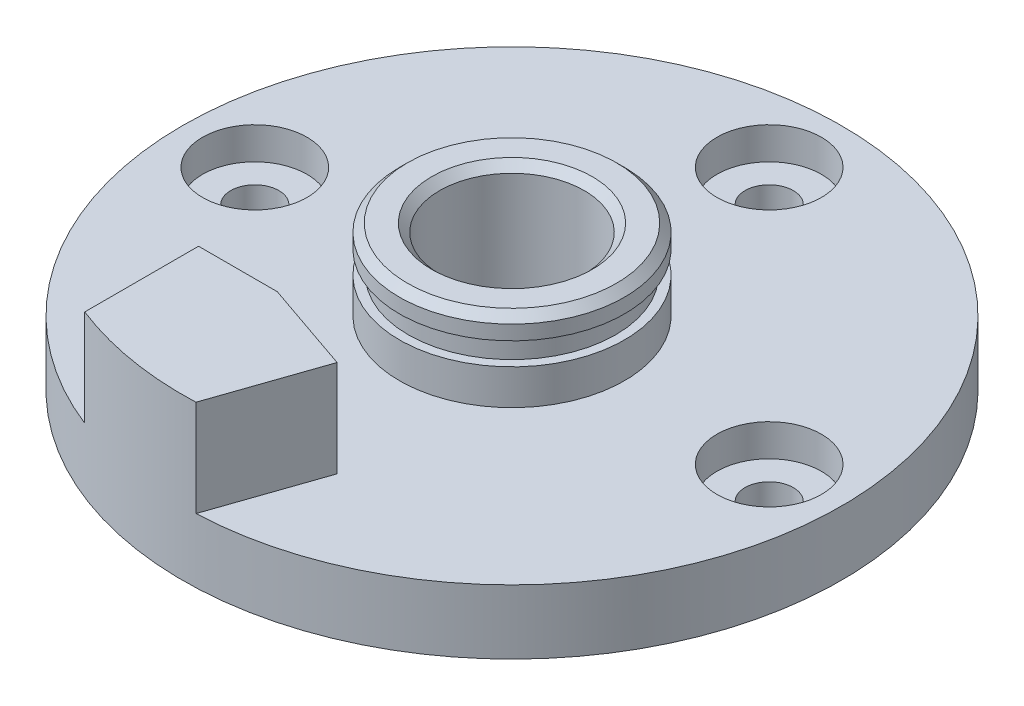
ISO-10303-21;
HEADER;
FILE_DESCRIPTION(('STEP AP214'),'2;1');
FILE_NAME('part.step','',(''),(''),'','','');
FILE_SCHEMA(('AUTOMOTIVE_DESIGN { 1 0 10303 214 1 1 1 1 }'));
ENDSEC;
DATA;
#1=APPLICATION_CONTEXT('core data for automotive mechanical design processes');
#2=APPLICATION_PROTOCOL_DEFINITION('international standard','automotive_design',2000,#1);
#3=PRODUCT_CONTEXT('',#1,'mechanical');
#4=PRODUCT('Part','Part','',(#3));
#5=PRODUCT_RELATED_PRODUCT_CATEGORY('part','',(#4));
#6=PRODUCT_DEFINITION_FORMATION('','',#4);
#7=PRODUCT_DEFINITION_CONTEXT('part definition',#1,'design');
#8=PRODUCT_DEFINITION('design','',#6,#7);
#9=PRODUCT_DEFINITION_SHAPE('','',#8);
#10=(LENGTH_UNIT() NAMED_UNIT(*) SI_UNIT(.MILLI.,.METRE.));
#11=(NAMED_UNIT(*) PLANE_ANGLE_UNIT() SI_UNIT($,.RADIAN.));
#12=(NAMED_UNIT(*) SI_UNIT($,.STERADIAN.) SOLID_ANGLE_UNIT());
#13=UNCERTAINTY_MEASURE_WITH_UNIT(LENGTH_MEASURE(1.E-05),#10,'distance_accuracy_value','');
#14=(GEOMETRIC_REPRESENTATION_CONTEXT(3) GLOBAL_UNCERTAINTY_ASSIGNED_CONTEXT((#13)) GLOBAL_UNIT_ASSIGNED_CONTEXT((#10,
#11,#12)) REPRESENTATION_CONTEXT('',''));
#15=CARTESIAN_POINT('',(0.,0.,0.));
#16=DIRECTION('',(0.,0.,1.));
#17=DIRECTION('',(1.,0.,0.));
#18=AXIS2_PLACEMENT_3D('',#15,#16,#17);
#19=CARTESIAN_POINT('',(-20.5,4.,0.));
#20=DIRECTION('',(0.,1.,0.));
#21=DIRECTION('',(-1.,0.,0.));
#22=AXIS2_PLACEMENT_3D('',#19,#20,#21);
#23=PLANE('',#22);
#24=CARTESIAN_POINT('',(-16.,4.,0.));
#25=DIRECTION('',(0.,1.,0.));
#26=DIRECTION('',(-1.,0.,0.));
#27=AXIS2_PLACEMENT_3D('',#24,#25,#26);
#28=CIRCLE('',#27,3.25);
#29=CARTESIAN_POINT('',(-19.25,4.,0.));
#30=VERTEX_POINT('',#29);
#31=EDGE_CURVE('E135',#30,#30,#28,.T.);
#32=ORIENTED_EDGE('',*,*,#31,.F.);
#33=EDGE_LOOP('',(#32));
#34=FACE_BOUND('',#33,.T.);
#35=CARTESIAN_POINT('',(0.,4.,-16.));
#36=DIRECTION('',(0.,1.,0.));
#37=DIRECTION('',(-1.,0.,0.));
#38=AXIS2_PLACEMENT_3D('',#35,#36,#37);
#39=CIRCLE('',#38,3.25);
#40=CARTESIAN_POINT('',(-3.25,4.,-16.));
#41=VERTEX_POINT('',#40);
#42=EDGE_CURVE('E141',#41,#41,#39,.T.);
#43=ORIENTED_EDGE('',*,*,#42,.F.);
#44=EDGE_LOOP('',(#43));
#45=FACE_BOUND('',#44,.T.);
#46=CARTESIAN_POINT('',(16.,3.99999999999999,0.));
#47=DIRECTION('',(0.,1.,0.));
#48=DIRECTION('',(-1.,0.,0.));
#49=AXIS2_PLACEMENT_3D('',#46,#47,#48);
#50=CIRCLE('',#49,3.25);
#51=CARTESIAN_POINT('',(12.75,3.99999999999999,0.));
#52=VERTEX_POINT('',#51);
#53=EDGE_CURVE('E130',#52,#52,#50,.T.);
#54=ORIENTED_EDGE('',*,*,#53,.F.);
#55=EDGE_LOOP('',(#54));
#56=FACE_BOUND('',#55,.T.);
#57=CARTESIAN_POINT('',(0.,4.,0.));
#58=DIRECTION('',(0.,1.,0.));
#59=DIRECTION('',(-1.,0.,0.));
#60=AXIS2_PLACEMENT_3D('',#57,#58,#59);
#61=CIRCLE('',#60,7.);
#62=CARTESIAN_POINT('',(-7.,4.,0.));
#63=VERTEX_POINT('',#62);
#64=EDGE_CURVE('E171',#63,#63,#61,.T.);
#65=ORIENTED_EDGE('',*,*,#64,.F.);
#66=EDGE_LOOP('',(#65));
#67=FACE_BOUND('',#66,.T.);
#68=DIRECTION('',(-0.94551857559932,0.,-0.325568154457147));
#69=VECTOR('',#68,1.);
#70=CARTESIAN_POINT('',(-2.6,4.,12.));
#71=LINE('',#70,#69);
#72=CARTESIAN_POINT('',(3.07311145359592,4.,13.9534089267429));
#73=VERTEX_POINT('',#72);
#74=CARTESIAN_POINT('',(-2.6,4.,12.));
#75=VERTEX_POINT('',#74);
#76=EDGE_CURVE('E47',#73,#75,#71,.T.);
#77=ORIENTED_EDGE('',*,*,#76,.F.);
#78=DIRECTION('',(0.325568154457147,0.,-0.94551857559932));
#79=VECTOR('',#78,1.);
#80=CARTESIAN_POINT('',(3.07311145359592,4.,13.9534089267429));
#81=LINE('',#80,#79);
#82=CARTESIAN_POINT('',(0.824652926444339,4.,20.4834066392997));
#83=VERTEX_POINT('',#82);
#84=EDGE_CURVE('E51',#83,#73,#81,.T.);
#85=ORIENTED_EDGE('',*,*,#84,.F.);
#86=CARTESIAN_POINT('',(0.,4.,0.));
#87=DIRECTION('',(0.,1.,0.));
#88=DIRECTION('',(-1.,0.,0.));
#89=AXIS2_PLACEMENT_3D('',#86,#87,#88);
#90=CIRCLE('',#89,20.5);
#91=CARTESIAN_POINT('',(-7.5,4.,19.0787840283389));
#92=VERTEX_POINT('',#91);
#93=EDGE_CURVE('E95',#83,#92,#90,.T.);
#94=ORIENTED_EDGE('',*,*,#93,.T.);
#95=DIRECTION('',(0.,0.,1.));
#96=VECTOR('',#95,1.);
#97=CARTESIAN_POINT('',(-7.5,4.,12.));
#98=LINE('',#97,#96);
#99=CARTESIAN_POINT('',(-7.5,4.,12.));
#100=VERTEX_POINT('',#99);
#101=EDGE_CURVE('E121',#100,#92,#98,.T.);
#102=ORIENTED_EDGE('',*,*,#101,.F.);
#103=DIRECTION('',(-1.,0.,0.));
#104=VECTOR('',#103,1.);
#105=CARTESIAN_POINT('',(7.5,4.,12.));
#106=LINE('',#105,#104);
#107=EDGE_CURVE('E116',#75,#100,#106,.T.);
#108=ORIENTED_EDGE('',*,*,#107,.F.);
#109=EDGE_LOOP('',(#77,#85,#94,#102,#108));
#110=FACE_BOUND('',#109,.T.);
#111=ADVANCED_FACE('F32',(#34,#45,#56,#67,#110),#23,.T.);
#112=CARTESIAN_POINT('',(0.,7.,0.));
#113=DIRECTION('',(0.,1.,0.));
#114=DIRECTION('',(-1.,0.,0.));
#115=AXIS2_PLACEMENT_3D('',#112,#113,#114);
#116=CYLINDRICAL_SURFACE('',#115,4.5);
#117=CARTESIAN_POINT('',(0.,8.49999999999999,0.));
#118=DIRECTION('',(0.,1.,0.));
#119=DIRECTION('',(-1.,0.,0.));
#120=AXIS2_PLACEMENT_3D('',#117,#118,#119);
#121=CIRCLE('',#120,4.5);
#122=CARTESIAN_POINT('',(-4.5,8.49999999999999,0.));
#123=VERTEX_POINT('',#122);
#124=EDGE_CURVE('E188',#123,#123,#121,.T.);
#125=ORIENTED_EDGE('',*,*,#124,.T.);
#126=EDGE_LOOP('',(#125));
#127=FACE_BOUND('',#126,.T.);
#128=CARTESIAN_POINT('',(0.,1.50000000000001,0.));
#129=DIRECTION('',(0.,-1.,0.));
#130=DIRECTION('',(1.,0.,0.));
#131=AXIS2_PLACEMENT_3D('',#128,#129,#130);
#132=CIRCLE('',#131,4.5);
#133=CARTESIAN_POINT('',(4.5,1.50000000000001,0.));
#134=VERTEX_POINT('',#133);
#135=EDGE_CURVE('E178',#134,#134,#132,.T.);
#136=ORIENTED_EDGE('',*,*,#135,.T.);
#137=EDGE_LOOP('',(#136));
#138=FACE_BOUND('',#137,.T.);
#139=ADVANCED_FACE('F215',(#127,#138),#116,.F.);
#140=CARTESIAN_POINT('',(16.,9.,0.));
#141=DIRECTION('',(0.,-1.,0.));
#142=DIRECTION('',(0.,0.,-1.));
#143=AXIS2_PLACEMENT_3D('',#140,#141,#142);
#144=CYLINDRICAL_SURFACE('',#143,1.5);
#145=CARTESIAN_POINT('',(16.,0.,0.));
#146=DIRECTION('',(0.,1.,0.));
#147=DIRECTION('',(0.,0.,1.));
#148=AXIS2_PLACEMENT_3D('',#145,#146,#147);
#149=CIRCLE('',#148,1.5);
#150=CARTESIAN_POINT('',(16.,0.,1.5));
#151=VERTEX_POINT('',#150);
#152=EDGE_CURVE('E156',#151,#151,#149,.T.);
#153=ORIENTED_EDGE('',*,*,#152,.F.);
#154=EDGE_LOOP('',(#153));
#155=FACE_BOUND('',#154,.T.);
#156=CARTESIAN_POINT('',(16.,1.99999999999999,0.));
#157=DIRECTION('',(0.,1.,0.));
#158=DIRECTION('',(-1.,0.,0.));
#159=AXIS2_PLACEMENT_3D('',#156,#157,#158);
#160=CIRCLE('',#159,1.5);
#161=CARTESIAN_POINT('',(14.5,1.99999999999999,0.));
#162=VERTEX_POINT('',#161);
#163=EDGE_CURVE('E159',#162,#162,#160,.T.);
#164=ORIENTED_EDGE('',*,*,#163,.T.);
#165=EDGE_LOOP('',(#164));
#166=FACE_BOUND('',#165,.T.);
#167=ADVANCED_FACE('F221',(#155,#166),#144,.F.);
#168=CARTESIAN_POINT('',(0.,9.,-16.));
#169=DIRECTION('',(0.,-1.,0.));
#170=DIRECTION('',(0.,0.,-1.));
#171=AXIS2_PLACEMENT_3D('',#168,#169,#170);
#172=CYLINDRICAL_SURFACE('',#171,1.5);
#173=CARTESIAN_POINT('',(0.,0.,-16.));
#174=DIRECTION('',(0.,1.,0.));
#175=DIRECTION('',(0.,0.,1.));
#176=AXIS2_PLACEMENT_3D('',#173,#174,#175);
#177=CIRCLE('',#176,1.5);
#178=CARTESIAN_POINT('',(0.,0.,-14.5));
#179=VERTEX_POINT('',#178);
#180=EDGE_CURVE('E153',#179,#179,#177,.T.);
#181=ORIENTED_EDGE('',*,*,#180,.F.);
#182=EDGE_LOOP('',(#181));
#183=FACE_BOUND('',#182,.T.);
#184=CARTESIAN_POINT('',(0.,2.,-16.));
#185=DIRECTION('',(0.,1.,0.));
#186=DIRECTION('',(-1.,0.,0.));
#187=AXIS2_PLACEMENT_3D('',#184,#185,#186);
#188=CIRCLE('',#187,1.5);
#189=CARTESIAN_POINT('',(-1.5,2.,-16.));
#190=VERTEX_POINT('',#189);
#191=EDGE_CURVE('E181',#190,#190,#188,.T.);
#192=ORIENTED_EDGE('',*,*,#191,.T.);
#193=EDGE_LOOP('',(#192));
#194=FACE_BOUND('',#193,.T.);
#195=ADVANCED_FACE('F312',(#183,#194),#172,.F.);
#196=CARTESIAN_POINT('',(-16.,9.,0.));
#197=DIRECTION('',(0.,-1.,0.));
#198=DIRECTION('',(0.,0.,-1.));
#199=AXIS2_PLACEMENT_3D('',#196,#197,#198);
#200=CYLINDRICAL_SURFACE('',#199,1.5);
#201=CARTESIAN_POINT('',(-16.,0.,0.));
#202=DIRECTION('',(0.,1.,0.));
#203=DIRECTION('',(0.,0.,1.));
#204=AXIS2_PLACEMENT_3D('',#201,#202,#203);
#205=CIRCLE('',#204,1.5);
#206=CARTESIAN_POINT('',(-16.,0.,1.5));
#207=VERTEX_POINT('',#206);
#208=EDGE_CURVE('E149',#207,#207,#205,.T.);
#209=ORIENTED_EDGE('',*,*,#208,.F.);
#210=EDGE_LOOP('',(#209));
#211=FACE_BOUND('',#210,.T.);
#212=CARTESIAN_POINT('',(-16.,2.,0.));
#213=DIRECTION('',(0.,1.,0.));
#214=DIRECTION('',(-1.,0.,0.));
#215=AXIS2_PLACEMENT_3D('',#212,#213,#214);
#216=CIRCLE('',#215,1.5);
#217=CARTESIAN_POINT('',(-17.5,2.,0.));
#218=VERTEX_POINT('',#217);
#219=EDGE_CURVE('E134',#218,#218,#216,.T.);
#220=ORIENTED_EDGE('',*,*,#219,.T.);
#221=EDGE_LOOP('',(#220));
#222=FACE_BOUND('',#221,.T.);
#223=ADVANCED_FACE('F234',(#211,#222),#200,.F.);
#224=CARTESIAN_POINT('',(-4.5,0.,0.));
#225=DIRECTION('',(0.,-1.,0.));
#226=DIRECTION('',(1.,0.,0.));
#227=AXIS2_PLACEMENT_3D('',#224,#225,#226);
#228=PLANE('',#227);
#229=CARTESIAN_POINT('',(0.,0.,0.));
#230=DIRECTION('',(0.,-1.,0.));
#231=DIRECTION('',(1.,0.,0.));
#232=AXIS2_PLACEMENT_3D('',#229,#230,#231);
#233=CIRCLE('',#232,7.5);
#234=CARTESIAN_POINT('',(7.5,0.,0.));
#235=VERTEX_POINT('',#234);
#236=EDGE_CURVE('E112',#235,#235,#233,.T.);
#237=ORIENTED_EDGE('',*,*,#236,.F.);
#238=EDGE_LOOP('',(#237));
#239=FACE_BOUND('',#238,.T.);
#240=ORIENTED_EDGE('',*,*,#208,.T.);
#241=EDGE_LOOP('',(#240));
#242=FACE_BOUND('',#241,.T.);
#243=ORIENTED_EDGE('',*,*,#180,.T.);
#244=EDGE_LOOP('',(#243));
#245=FACE_BOUND('',#244,.T.);
#246=ORIENTED_EDGE('',*,*,#152,.T.);
#247=EDGE_LOOP('',(#246));
#248=FACE_BOUND('',#247,.T.);
#249=CARTESIAN_POINT('',(0.,0.,0.));
#250=DIRECTION('',(0.,1.,0.));
#251=DIRECTION('',(-1.,0.,0.));
#252=AXIS2_PLACEMENT_3D('',#249,#250,#251);
#253=CIRCLE('',#252,20.5);
#254=CARTESIAN_POINT('',(-20.5,0.,0.));
#255=VERTEX_POINT('',#254);
#256=EDGE_CURVE('E175',#255,#255,#253,.T.);
#257=ORIENTED_EDGE('',*,*,#256,.F.);
#258=EDGE_LOOP('',(#257));
#259=FACE_BOUND('',#258,.T.);
#260=ADVANCED_FACE('F232',(#239,#242,#245,#248,#259),#228,.T.);
#261=CARTESIAN_POINT('',(0.,7.,0.));
#262=DIRECTION('',(0.,1.,0.));
#263=DIRECTION('',(-1.,0.,0.));
#264=AXIS2_PLACEMENT_3D('',#261,#262,#263);
#265=CYLINDRICAL_SURFACE('',#264,20.5);
#266=ORIENTED_EDGE('',*,*,#93,.F.);
#267=DIRECTION('',(0.,-1.,0.));
#268=VECTOR('',#267,1.);
#269=CARTESIAN_POINT('',(0.824652926444336,10.,20.4834066392997));
#270=LINE('',#269,#268);
#271=CARTESIAN_POINT('',(0.824652926444336,10.,20.4834066392997));
#272=VERTEX_POINT('',#271);
#273=EDGE_CURVE('E92',#272,#83,#270,.T.);
#274=ORIENTED_EDGE('',*,*,#273,.F.);
#275=CARTESIAN_POINT('',(0.,10.,0.));
#276=DIRECTION('',(0.,1.,0.));
#277=DIRECTION('',(1.,0.,0.));
#278=AXIS2_PLACEMENT_3D('',#275,#276,#277);
#279=CIRCLE('',#278,20.5);
#280=CARTESIAN_POINT('',(-7.49999999999999,10.,19.0787840283389));
#281=VERTEX_POINT('',#280);
#282=EDGE_CURVE('E77',#281,#272,#279,.T.);
#283=ORIENTED_EDGE('',*,*,#282,.F.);
#284=DIRECTION('',(0.,-1.,0.));
#285=VECTOR('',#284,1.);
#286=CARTESIAN_POINT('',(-7.49999999999999,10.,19.0787840283389));
#287=LINE('',#286,#285);
#288=EDGE_CURVE('E89',#281,#92,#287,.T.);
#289=ORIENTED_EDGE('',*,*,#288,.T.);
#290=EDGE_LOOP('',(#266,#274,#283,#289));
#291=FACE_BOUND('',#290,.T.);
#292=ORIENTED_EDGE('',*,*,#256,.T.);
#293=EDGE_LOOP('',(#292));
#294=FACE_BOUND('',#293,.T.);
#295=ADVANCED_FACE('F93',(#291,#294),#265,.T.);
#296=CARTESIAN_POINT('',(0.,7.,0.));
#297=DIRECTION('',(0.,1.,0.));
#298=DIRECTION('',(-1.,0.,0.));
#299=AXIS2_PLACEMENT_3D('',#296,#297,#298);
#300=CYLINDRICAL_SURFACE('',#299,7.);
#301=ORIENTED_EDGE('',*,*,#64,.T.);
#302=EDGE_LOOP('',(#301));
#303=FACE_BOUND('',#302,.T.);
#304=CARTESIAN_POINT('',(0.,6.2,0.));
#305=DIRECTION('',(0.,1.,0.));
#306=DIRECTION('',(-1.,0.,0.));
#307=AXIS2_PLACEMENT_3D('',#304,#305,#306);
#308=CIRCLE('',#307,7.);
#309=CARTESIAN_POINT('',(-7.,6.2,0.));
#310=VERTEX_POINT('',#309);
#311=EDGE_CURVE('E168',#310,#310,#308,.T.);
#312=ORIENTED_EDGE('',*,*,#311,.F.);
#313=EDGE_LOOP('',(#312));
#314=FACE_BOUND('',#313,.T.);
#315=ADVANCED_FACE('F228',(#303,#314),#300,.T.);
#316=CARTESIAN_POINT('',(-7.,6.2,0.));
#317=DIRECTION('',(0.,1.,0.));
#318=DIRECTION('',(-1.,0.,0.));
#319=AXIS2_PLACEMENT_3D('',#316,#317,#318);
#320=PLANE('',#319);
#321=ORIENTED_EDGE('',*,*,#311,.T.);
#322=EDGE_LOOP('',(#321));
#323=FACE_BOUND('',#322,.T.);
#324=CARTESIAN_POINT('',(0.,6.2,0.));
#325=DIRECTION('',(0.,1.,0.));
#326=DIRECTION('',(-1.,0.,0.));
#327=AXIS2_PLACEMENT_3D('',#324,#325,#326);
#328=CIRCLE('',#327,6.45);
#329=CARTESIAN_POINT('',(-6.45,6.2,0.));
#330=VERTEX_POINT('',#329);
#331=EDGE_CURVE('E165',#330,#330,#328,.T.);
#332=ORIENTED_EDGE('',*,*,#331,.F.);
#333=EDGE_LOOP('',(#332));
#334=FACE_BOUND('',#333,.T.);
#335=ADVANCED_FACE('F274',(#323,#334),#320,.T.);
#336=CARTESIAN_POINT('',(0.,7.,0.));
#337=DIRECTION('',(0.,1.,0.));
#338=DIRECTION('',(-1.,0.,0.));
#339=AXIS2_PLACEMENT_3D('',#336,#337,#338);
#340=CYLINDRICAL_SURFACE('',#339,6.45);
#341=ORIENTED_EDGE('',*,*,#331,.T.);
#342=EDGE_LOOP('',(#341));
#343=FACE_BOUND('',#342,.T.);
#344=CARTESIAN_POINT('',(0.,7.6,0.));
#345=DIRECTION('',(0.,1.,0.));
#346=DIRECTION('',(-1.,0.,0.));
#347=AXIS2_PLACEMENT_3D('',#344,#345,#346);
#348=CIRCLE('',#347,6.45);
#349=CARTESIAN_POINT('',(-6.45,7.6,0.));
#350=VERTEX_POINT('',#349);
#351=EDGE_CURVE('E162',#350,#350,#348,.T.);
#352=ORIENTED_EDGE('',*,*,#351,.F.);
#353=EDGE_LOOP('',(#352));
#354=FACE_BOUND('',#353,.T.);
#355=ADVANCED_FACE('F271',(#343,#354),#340,.T.);
#356=CARTESIAN_POINT('',(-6.45,7.6,0.));
#357=DIRECTION('',(0.,-1.,0.));
#358=DIRECTION('',(1.,0.,0.));
#359=AXIS2_PLACEMENT_3D('',#356,#357,#358);
#360=PLANE('',#359);
#361=ORIENTED_EDGE('',*,*,#351,.T.);
#362=EDGE_LOOP('',(#361));
#363=FACE_BOUND('',#362,.T.);
#364=CARTESIAN_POINT('',(0.,7.6,0.));
#365=DIRECTION('',(0.,1.,0.));
#366=DIRECTION('',(-1.,0.,0.));
#367=AXIS2_PLACEMENT_3D('',#364,#365,#366);
#368=CIRCLE('',#367,7.);
#369=CARTESIAN_POINT('',(-7.,7.6,0.));
#370=VERTEX_POINT('',#369);
#371=EDGE_CURVE('E152',#370,#370,#368,.T.);
#372=ORIENTED_EDGE('',*,*,#371,.F.);
#373=EDGE_LOOP('',(#372));
#374=FACE_BOUND('',#373,.T.);
#375=ADVANCED_FACE('F263',(#363,#374),#360,.T.);
#376=CARTESIAN_POINT('',(0.,7.,0.));
#377=DIRECTION('',(0.,1.,0.));
#378=DIRECTION('',(-1.,0.,0.));
#379=AXIS2_PLACEMENT_3D('',#376,#377,#378);
#380=CYLINDRICAL_SURFACE('',#379,7.);
#381=CARTESIAN_POINT('',(0.,8.5,0.));
#382=DIRECTION('',(0.,1.,0.));
#383=DIRECTION('',(-1.,0.,0.));
#384=AXIS2_PLACEMENT_3D('',#381,#382,#383);
#385=CIRCLE('',#384,7.);
#386=CARTESIAN_POINT('',(-7.,8.5,0.));
#387=VERTEX_POINT('',#386);
#388=EDGE_CURVE('E11',#387,#387,#385,.F.);
#389=ORIENTED_EDGE('',*,*,#388,.T.);
#390=EDGE_LOOP('',(#389));
#391=FACE_BOUND('',#390,.T.);
#392=ORIENTED_EDGE('',*,*,#371,.T.);
#393=EDGE_LOOP('',(#392));
#394=FACE_BOUND('',#393,.T.);
#395=ADVANCED_FACE('F254',(#391,#394),#380,.T.);
#396=CARTESIAN_POINT('',(-7.,9.,0.));
#397=DIRECTION('',(0.,1.,0.));
#398=DIRECTION('',(-1.,0.,0.));
#399=AXIS2_PLACEMENT_3D('',#396,#397,#398);
#400=PLANE('',#399);
#401=CARTESIAN_POINT('',(0.,9.,0.));
#402=DIRECTION('',(0.,1.,0.));
#403=DIRECTION('',(-1.,0.,0.));
#404=AXIS2_PLACEMENT_3D('',#401,#402,#403);
#405=CIRCLE('',#404,6.50000000000001);
#406=CARTESIAN_POINT('',(-6.50000000000001,9.,0.));
#407=VERTEX_POINT('',#406);
#408=EDGE_CURVE('E40',#407,#407,#405,.T.);
#409=ORIENTED_EDGE('',*,*,#408,.T.);
#410=EDGE_LOOP('',(#409));
#411=FACE_BOUND('',#410,.T.);
#412=CARTESIAN_POINT('',(0.,9.,0.));
#413=DIRECTION('',(0.,1.,0.));
#414=DIRECTION('',(-1.,0.,0.));
#415=AXIS2_PLACEMENT_3D('',#412,#413,#414);
#416=CIRCLE('',#415,5.00000000000001);
#417=CARTESIAN_POINT('',(-5.00000000000001,9.,0.));
#418=VERTEX_POINT('',#417);
#419=EDGE_CURVE('E191',#418,#418,#416,.F.);
#420=ORIENTED_EDGE('',*,*,#419,.T.);
#421=EDGE_LOOP('',(#420));
#422=FACE_BOUND('',#421,.T.);
#423=ADVANCED_FACE('F199',(#411,#422),#400,.T.);
#424=CARTESIAN_POINT('',(-16.,2.,0.));
#425=DIRECTION('',(0.,1.,0.));
#426=DIRECTION('',(0.,0.,1.));
#427=AXIS2_PLACEMENT_3D('',#424,#425,#426);
#428=CYLINDRICAL_SURFACE('',#427,3.25);
#429=CARTESIAN_POINT('',(-16.,2.,0.));
#430=DIRECTION('',(0.,1.,0.));
#431=DIRECTION('',(-1.,0.,0.));
#432=AXIS2_PLACEMENT_3D('',#429,#430,#431);
#433=CIRCLE('',#432,3.25);
#434=CARTESIAN_POINT('',(-19.25,2.,0.));
#435=VERTEX_POINT('',#434);
#436=EDGE_CURVE('E131',#435,#435,#433,.T.);
#437=ORIENTED_EDGE('',*,*,#436,.F.);
#438=EDGE_LOOP('',(#437));
#439=FACE_BOUND('',#438,.T.);
#440=ORIENTED_EDGE('',*,*,#31,.T.);
#441=EDGE_LOOP('',(#440));
#442=FACE_BOUND('',#441,.T.);
#443=ADVANCED_FACE('F253',(#439,#442),#428,.F.);
#444=CARTESIAN_POINT('',(-16.,2.,0.));
#445=DIRECTION('',(0.,1.,0.));
#446=DIRECTION('',(-1.,0.,0.));
#447=AXIS2_PLACEMENT_3D('',#444,#445,#446);
#448=PLANE('',#447);
#449=ORIENTED_EDGE('',*,*,#219,.F.);
#450=EDGE_LOOP('',(#449));
#451=FACE_BOUND('',#450,.T.);
#452=ORIENTED_EDGE('',*,*,#436,.T.);
#453=EDGE_LOOP('',(#452));
#454=FACE_BOUND('',#453,.T.);
#455=ADVANCED_FACE('F260',(#451,#454),#448,.T.);
#456=CARTESIAN_POINT('',(0.,2.,-16.));
#457=DIRECTION('',(0.,1.,0.));
#458=DIRECTION('',(0.,0.,1.));
#459=AXIS2_PLACEMENT_3D('',#456,#457,#458);
#460=CYLINDRICAL_SURFACE('',#459,3.25);
#461=CARTESIAN_POINT('',(0.,2.,-16.));
#462=DIRECTION('',(0.,1.,0.));
#463=DIRECTION('',(-1.,0.,0.));
#464=AXIS2_PLACEMENT_3D('',#461,#462,#463);
#465=CIRCLE('',#464,3.25);
#466=CARTESIAN_POINT('',(-3.25,2.,-16.));
#467=VERTEX_POINT('',#466);
#468=EDGE_CURVE('E138',#467,#467,#465,.T.);
#469=ORIENTED_EDGE('',*,*,#468,.F.);
#470=EDGE_LOOP('',(#469));
#471=FACE_BOUND('',#470,.T.);
#472=ORIENTED_EDGE('',*,*,#42,.T.);
#473=EDGE_LOOP('',(#472));
#474=FACE_BOUND('',#473,.T.);
#475=ADVANCED_FACE('F424',(#471,#474),#460,.F.);
#476=CARTESIAN_POINT('',(0.,2.,-16.));
#477=DIRECTION('',(0.,1.,0.));
#478=DIRECTION('',(-1.,0.,0.));
#479=AXIS2_PLACEMENT_3D('',#476,#477,#478);
#480=PLANE('',#479);
#481=ORIENTED_EDGE('',*,*,#191,.F.);
#482=EDGE_LOOP('',(#481));
#483=FACE_BOUND('',#482,.T.);
#484=ORIENTED_EDGE('',*,*,#468,.T.);
#485=EDGE_LOOP('',(#484));
#486=FACE_BOUND('',#485,.T.);
#487=ADVANCED_FACE('F427',(#483,#486),#480,.T.);
#488=CARTESIAN_POINT('',(16.,1.99999999999999,0.));
#489=DIRECTION('',(0.,1.,0.));
#490=DIRECTION('',(0.,0.,1.));
#491=AXIS2_PLACEMENT_3D('',#488,#489,#490);
#492=CYLINDRICAL_SURFACE('',#491,3.25);
#493=CARTESIAN_POINT('',(16.,1.99999999999999,0.));
#494=DIRECTION('',(0.,1.,0.));
#495=DIRECTION('',(-1.,0.,0.));
#496=AXIS2_PLACEMENT_3D('',#493,#494,#495);
#497=CIRCLE('',#496,3.25);
#498=CARTESIAN_POINT('',(12.75,2.,0.));
#499=VERTEX_POINT('',#498);
#500=EDGE_CURVE('E144',#499,#499,#497,.T.);
#501=ORIENTED_EDGE('',*,*,#500,.F.);
#502=EDGE_LOOP('',(#501));
#503=FACE_BOUND('',#502,.T.);
#504=ORIENTED_EDGE('',*,*,#53,.T.);
#505=EDGE_LOOP('',(#504));
#506=FACE_BOUND('',#505,.T.);
#507=ADVANCED_FACE('F430',(#503,#506),#492,.F.);
#508=CARTESIAN_POINT('',(16.,1.99999999999999,0.));
#509=DIRECTION('',(0.,1.,0.));
#510=DIRECTION('',(-1.,0.,0.));
#511=AXIS2_PLACEMENT_3D('',#508,#509,#510);
#512=PLANE('',#511);
#513=ORIENTED_EDGE('',*,*,#163,.F.);
#514=EDGE_LOOP('',(#513));
#515=FACE_BOUND('',#514,.T.);
#516=ORIENTED_EDGE('',*,*,#500,.T.);
#517=EDGE_LOOP('',(#516));
#518=FACE_BOUND('',#517,.T.);
#519=ADVANCED_FACE('F421',(#515,#518),#512,.T.);
#520=CARTESIAN_POINT('',(7.5,9.99999999999999,12.));
#521=DIRECTION('',(0.,0.,1.));
#522=DIRECTION('',(1.,0.,0.));
#523=AXIS2_PLACEMENT_3D('',#520,#521,#522);
#524=PLANE('',#523);
#525=DIRECTION('',(-1.,0.,0.));
#526=VECTOR('',#525,1.);
#527=CARTESIAN_POINT('',(7.5,9.99999999999999,12.));
#528=LINE('',#527,#526);
#529=CARTESIAN_POINT('',(-2.6,10.,12.));
#530=VERTEX_POINT('',#529);
#531=CARTESIAN_POINT('',(-7.5,10.,12.));
#532=VERTEX_POINT('',#531);
#533=EDGE_CURVE('E119',#530,#532,#528,.T.);
#534=ORIENTED_EDGE('',*,*,#533,.F.);
#535=DIRECTION('',(0.,1.,0.));
#536=VECTOR('',#535,1.);
#537=CARTESIAN_POINT('',(-2.6,4.,12.));
#538=LINE('',#537,#536);
#539=EDGE_CURVE('E97',#75,#530,#538,.T.);
#540=ORIENTED_EDGE('',*,*,#539,.F.);
#541=ORIENTED_EDGE('',*,*,#107,.T.);
#542=DIRECTION('',(0.,-1.,0.));
#543=VECTOR('',#542,1.);
#544=CARTESIAN_POINT('',(-7.5,10.,12.));
#545=LINE('',#544,#543);
#546=EDGE_CURVE('E127',#532,#100,#545,.T.);
#547=ORIENTED_EDGE('',*,*,#546,.F.);
#548=EDGE_LOOP('',(#534,#540,#541,#547));
#549=FACE_BOUND('',#548,.T.);
#550=ADVANCED_FACE('F417',(#549),#524,.F.);
#551=CARTESIAN_POINT('',(-7.5,10.,12.));
#552=DIRECTION('',(1.,0.,0.));
#553=DIRECTION('',(0.,0.,-1.));
#554=AXIS2_PLACEMENT_3D('',#551,#552,#553);
#555=PLANE('',#554);
#556=ORIENTED_EDGE('',*,*,#101,.T.);
#557=ORIENTED_EDGE('',*,*,#288,.F.);
#558=DIRECTION('',(0.,0.,1.));
#559=VECTOR('',#558,1.);
#560=CARTESIAN_POINT('',(-7.5,10.,12.));
#561=LINE('',#560,#559);
#562=EDGE_CURVE('E85',#532,#281,#561,.T.);
#563=ORIENTED_EDGE('',*,*,#562,.F.);
#564=ORIENTED_EDGE('',*,*,#546,.T.);
#565=EDGE_LOOP('',(#556,#557,#563,#564));
#566=FACE_BOUND('',#565,.T.);
#567=ADVANCED_FACE('F392',(#566),#555,.F.);
#568=CARTESIAN_POINT('',(0.,10.,0.));
#569=DIRECTION('',(0.,-1.,0.));
#570=DIRECTION('',(1.,0.,0.));
#571=AXIS2_PLACEMENT_3D('',#568,#569,#570);
#572=PLANE('',#571);
#573=ORIENTED_EDGE('',*,*,#282,.T.);
#574=DIRECTION('',(0.325568154457147,0.,-0.94551857559932));
#575=VECTOR('',#574,1.);
#576=CARTESIAN_POINT('',(3.07311145359592,10.,13.9534089267429));
#577=LINE('',#576,#575);
#578=CARTESIAN_POINT('',(3.07311145359592,10.,13.9534089267429));
#579=VERTEX_POINT('',#578);
#580=EDGE_CURVE('E82',#272,#579,#577,.T.);
#581=ORIENTED_EDGE('',*,*,#580,.T.);
#582=DIRECTION('',(-0.94551857559932,0.,-0.325568154457147));
#583=VECTOR('',#582,1.);
#584=CARTESIAN_POINT('',(-2.6,10.,12.));
#585=LINE('',#584,#583);
#586=EDGE_CURVE('E103',#579,#530,#585,.T.);
#587=ORIENTED_EDGE('',*,*,#586,.T.);
#588=ORIENTED_EDGE('',*,*,#533,.T.);
#589=ORIENTED_EDGE('',*,*,#562,.T.);
#590=EDGE_LOOP('',(#573,#581,#587,#588,#589));
#591=FACE_BOUND('',#590,.T.);
#592=ADVANCED_FACE('F79',(#591),#572,.F.);
#593=CARTESIAN_POINT('',(0.,1.,0.));
#594=DIRECTION('',(0.,-1.,0.));
#595=DIRECTION('',(1.,0.,0.));
#596=AXIS2_PLACEMENT_3D('',#593,#594,#595);
#597=CYLINDRICAL_SURFACE('',#596,7.5);
#598=CARTESIAN_POINT('',(0.,1.,0.));
#599=DIRECTION('',(0.,-1.,0.));
#600=DIRECTION('',(1.,0.,0.));
#601=AXIS2_PLACEMENT_3D('',#598,#599,#600);
#602=CIRCLE('',#601,7.5);
#603=CARTESIAN_POINT('',(7.5,0.999999999999999,0.));
#604=VERTEX_POINT('',#603);
#605=EDGE_CURVE('E113',#604,#604,#602,.T.);
#606=ORIENTED_EDGE('',*,*,#605,.F.);
#607=EDGE_LOOP('',(#606));
#608=FACE_BOUND('',#607,.T.);
#609=ORIENTED_EDGE('',*,*,#236,.T.);
#610=EDGE_LOOP('',(#609));
#611=FACE_BOUND('',#610,.T.);
#612=ADVANCED_FACE('F243',(#608,#611),#597,.F.);
#613=CARTESIAN_POINT('',(0.,1.,0.));
#614=DIRECTION('',(0.,-1.,0.));
#615=DIRECTION('',(1.,0.,0.));
#616=AXIS2_PLACEMENT_3D('',#613,#614,#615);
#617=PLANE('',#616);
#618=CARTESIAN_POINT('',(0.,1.,0.));
#619=DIRECTION('',(0.,-1.,0.));
#620=DIRECTION('',(1.,0.,0.));
#621=AXIS2_PLACEMENT_3D('',#618,#619,#620);
#622=CIRCLE('',#621,5.00000000000002);
#623=CARTESIAN_POINT('',(5.00000000000002,0.999999999999999,0.));
#624=VERTEX_POINT('',#623);
#625=EDGE_CURVE('E194',#624,#624,#622,.F.);
#626=ORIENTED_EDGE('',*,*,#625,.T.);
#627=EDGE_LOOP('',(#626));
#628=FACE_BOUND('',#627,.T.);
#629=ORIENTED_EDGE('',*,*,#605,.T.);
#630=EDGE_LOOP('',(#629));
#631=FACE_BOUND('',#630,.T.);
#632=ADVANCED_FACE('F238',(#628,#631),#617,.T.);
#633=CARTESIAN_POINT('',(0.,8.49999999999999,0.));
#634=DIRECTION('',(0.,1.,0.));
#635=DIRECTION('',(-1.,0.,0.));
#636=AXIS2_PLACEMENT_3D('',#633,#634,#635);
#637=CONICAL_SURFACE('',#636,4.5,0.785398163397454);
#638=ORIENTED_EDGE('',*,*,#419,.F.);
#639=EDGE_LOOP('',(#638));
#640=FACE_BOUND('',#639,.T.);
#641=ORIENTED_EDGE('',*,*,#124,.F.);
#642=EDGE_LOOP('',(#641));
#643=FACE_BOUND('',#642,.T.);
#644=ADVANCED_FACE('F211',(#640,#643),#637,.F.);
#645=CARTESIAN_POINT('',(0.,1.50000000000001,0.));
#646=DIRECTION('',(0.,-1.,0.));
#647=DIRECTION('',(1.,0.,0.));
#648=AXIS2_PLACEMENT_3D('',#645,#646,#647);
#649=CONICAL_SURFACE('',#648,4.5,0.785398163397453);
#650=ORIENTED_EDGE('',*,*,#625,.F.);
#651=EDGE_LOOP('',(#650));
#652=FACE_BOUND('',#651,.T.);
#653=ORIENTED_EDGE('',*,*,#135,.F.);
#654=EDGE_LOOP('',(#653));
#655=FACE_BOUND('',#654,.T.);
#656=ADVANCED_FACE('F203',(#652,#655),#649,.F.);
#657=CARTESIAN_POINT('',(0.,9.,0.));
#658=DIRECTION('',(0.,-1.,0.));
#659=DIRECTION('',(1.,0.,0.));
#660=AXIS2_PLACEMENT_3D('',#657,#658,#659);
#661=CONICAL_SURFACE('',#660,6.50000000000001,0.785398163397446);
#662=ORIENTED_EDGE('',*,*,#388,.F.);
#663=EDGE_LOOP('',(#662));
#664=FACE_BOUND('',#663,.T.);
#665=ORIENTED_EDGE('',*,*,#408,.F.);
#666=EDGE_LOOP('',(#665));
#667=FACE_BOUND('',#666,.T.);
#668=ADVANCED_FACE('F34',(#664,#667),#661,.T.);
#669=CARTESIAN_POINT('',(3.07311145359592,10.,13.9534089267429));
#670=DIRECTION('',(-0.94551857559932,0.,-0.325568154457147));
#671=DIRECTION('',(-0.325568154457147,0.,0.94551857559932));
#672=AXIS2_PLACEMENT_3D('',#669,#670,#671);
#673=PLANE('',#672);
#674=ORIENTED_EDGE('',*,*,#84,.T.);
#675=DIRECTION('',(0.,-1.,0.));
#676=VECTOR('',#675,1.);
#677=CARTESIAN_POINT('',(3.07311145359592,10.,13.9534089267429));
#678=LINE('',#677,#676);
#679=EDGE_CURVE('E98',#579,#73,#678,.T.);
#680=ORIENTED_EDGE('',*,*,#679,.F.);
#681=ORIENTED_EDGE('',*,*,#580,.F.);
#682=ORIENTED_EDGE('',*,*,#273,.T.);
#683=EDGE_LOOP('',(#674,#680,#681,#682));
#684=FACE_BOUND('',#683,.T.);
#685=ADVANCED_FACE('F100',(#684),#673,.F.);
#686=CARTESIAN_POINT('',(-2.6,10.,12.));
#687=DIRECTION('',(-0.325568154457147,0.,0.94551857559932));
#688=DIRECTION('',(0.94551857559932,0.,0.325568154457147));
#689=AXIS2_PLACEMENT_3D('',#686,#687,#688);
#690=PLANE('',#689);
#691=ORIENTED_EDGE('',*,*,#76,.T.);
#692=ORIENTED_EDGE('',*,*,#539,.T.);
#693=ORIENTED_EDGE('',*,*,#586,.F.);
#694=ORIENTED_EDGE('',*,*,#679,.T.);
#695=EDGE_LOOP('',(#691,#692,#693,#694));
#696=FACE_BOUND('',#695,.T.);
#697=ADVANCED_FACE('F209',(#696),#690,.F.);
#698=CLOSED_SHELL('',(#111,#139,#167,#195,#223,#260,#295,#315,#335,#355,#375,#395,#423,#443,
#455,#475,#487,#507,#519,#550,#567,#592,#612,#632,#644,#656,#668,#685,#697));
#699=MANIFOLD_SOLID_BREP('B2',#698);
#700=ADVANCED_BREP_SHAPE_REPRESENTATION('',(#18,#699),#14);
#701=SHAPE_DEFINITION_REPRESENTATION(#9,#700);
ENDSEC;
END-ISO-10303-21;
